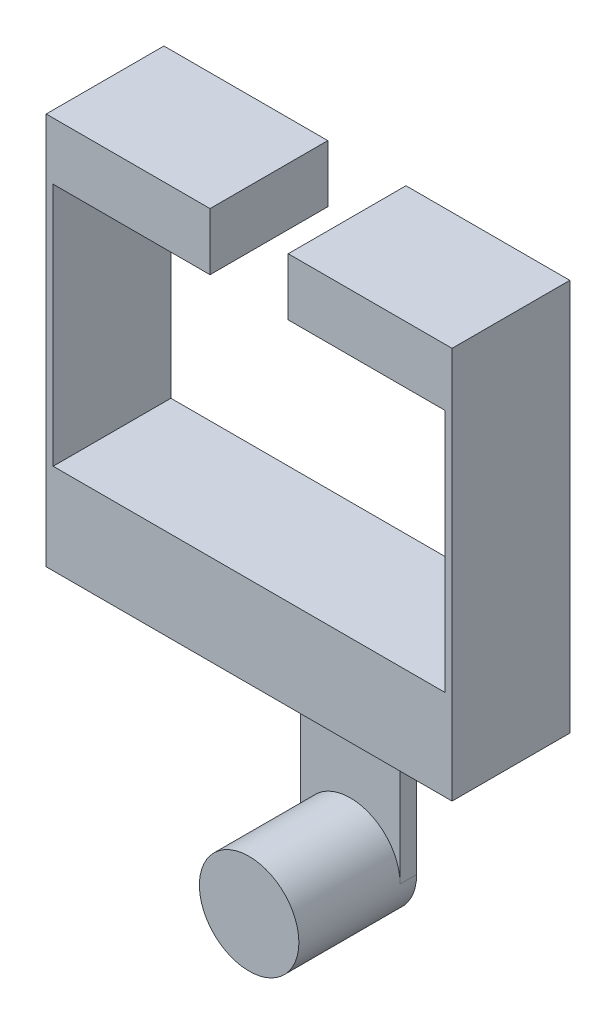
ISO-10303-21;
HEADER;
FILE_DESCRIPTION(('STEP AP214'),'2;1');
FILE_NAME('part.step','',(''),(''),'','','');
FILE_SCHEMA(('AUTOMOTIVE_DESIGN { 1 0 10303 214 1 1 1 1 }'));
ENDSEC;
DATA;
#1=APPLICATION_CONTEXT('core data for automotive mechanical design processes');
#2=APPLICATION_PROTOCOL_DEFINITION('international standard','automotive_design',2000,#1);
#3=PRODUCT_CONTEXT('',#1,'mechanical');
#4=PRODUCT('Part','Part','',(#3));
#5=PRODUCT_RELATED_PRODUCT_CATEGORY('part','',(#4));
#6=PRODUCT_DEFINITION_FORMATION('','',#4);
#7=PRODUCT_DEFINITION_CONTEXT('part definition',#1,'design');
#8=PRODUCT_DEFINITION('design','',#6,#7);
#9=PRODUCT_DEFINITION_SHAPE('','',#8);
#10=(LENGTH_UNIT() NAMED_UNIT(*) SI_UNIT(.MILLI.,.METRE.));
#11=(NAMED_UNIT(*) PLANE_ANGLE_UNIT() SI_UNIT($,.RADIAN.));
#12=(NAMED_UNIT(*) SI_UNIT($,.STERADIAN.) SOLID_ANGLE_UNIT());
#13=UNCERTAINTY_MEASURE_WITH_UNIT(LENGTH_MEASURE(1.E-05),#10,'distance_accuracy_value','');
#14=(GEOMETRIC_REPRESENTATION_CONTEXT(3) GLOBAL_UNCERTAINTY_ASSIGNED_CONTEXT((#13)) GLOBAL_UNIT_ASSIGNED_CONTEXT((#10,
#11,#12)) REPRESENTATION_CONTEXT('',''));
#15=CARTESIAN_POINT('',(0.,0.,0.));
#16=DIRECTION('',(0.,0.,1.));
#17=DIRECTION('',(1.,0.,0.));
#18=AXIS2_PLACEMENT_3D('',#15,#16,#17);
#19=CARTESIAN_POINT('',(0.,0.,19.05));
#20=DIRECTION('',(0.,0.,-1.));
#21=DIRECTION('',(-1.,0.,0.));
#22=AXIS2_PLACEMENT_3D('',#19,#20,#21);
#23=CYLINDRICAL_SURFACE('',#22,8.04977532478733);
#24=CARTESIAN_POINT('',(0.,0.,19.05));
#25=DIRECTION('',(0.,0.,1.));
#26=DIRECTION('',(1.,0.,0.));
#27=AXIS2_PLACEMENT_3D('',#24,#25,#26);
#28=CIRCLE('',#27,8.04977532478733);
#29=CARTESIAN_POINT('',(8.04977532478733,0.,19.05));
#30=VERTEX_POINT('',#29);
#31=EDGE_CURVE('E52',#30,#30,#28,.T.);
#32=ORIENTED_EDGE('',*,*,#31,.F.);
#33=EDGE_LOOP('',(#32));
#34=FACE_BOUND('',#33,.T.);
#35=DIRECTION('',(0.,0.,-1.));
#36=VECTOR('',#35,1.);
#37=CARTESIAN_POINT('',(8.04977532478733,0.,2.67154454200887));
#38=LINE('',#37,#36);
#39=CARTESIAN_POINT('',(8.04977532478733,0.,2.67154454200887));
#40=VERTEX_POINT('',#39);
#41=CARTESIAN_POINT('',(8.04977532478733,0.,0.));
#42=VERTEX_POINT('',#41);
#43=EDGE_CURVE('E274',#40,#42,#38,.T.);
#44=ORIENTED_EDGE('',*,*,#43,.F.);
#45=CARTESIAN_POINT('',(0.,0.,2.67154454200887));
#46=DIRECTION('',(0.,0.,-1.));
#47=DIRECTION('',(-1.,0.,0.));
#48=AXIS2_PLACEMENT_3D('',#45,#46,#47);
#49=CIRCLE('',#48,8.04977532478733);
#50=CARTESIAN_POINT('',(-8.04977532478733,0.,2.67154454200887));
#51=VERTEX_POINT('',#50);
#52=EDGE_CURVE('E11',#51,#40,#49,.T.);
#53=ORIENTED_EDGE('',*,*,#52,.F.);
#54=DIRECTION('',(0.,0.,-1.));
#55=VECTOR('',#54,1.);
#56=CARTESIAN_POINT('',(-8.04977532478733,0.,2.67154454200887));
#57=LINE('',#56,#55);
#58=CARTESIAN_POINT('',(-8.04977532478733,0.,0.));
#59=VERTEX_POINT('',#58);
#60=EDGE_CURVE('E65',#51,#59,#57,.T.);
#61=ORIENTED_EDGE('',*,*,#60,.T.);
#62=CARTESIAN_POINT('',(0.,0.,0.));
#63=DIRECTION('',(0.,0.,1.));
#64=DIRECTION('',(1.,0.,0.));
#65=AXIS2_PLACEMENT_3D('',#62,#63,#64);
#66=CIRCLE('',#65,8.04977532478733);
#67=EDGE_CURVE('E279',#59,#42,#66,.T.);
#68=ORIENTED_EDGE('',*,*,#67,.T.);
#69=EDGE_LOOP('',(#44,#53,#61,#68));
#70=FACE_BOUND('',#69,.T.);
#71=ADVANCED_FACE('F46',(#34,#70),#23,.T.);
#72=CARTESIAN_POINT('',(0.,0.,19.05));
#73=DIRECTION('',(0.,0.,1.));
#74=DIRECTION('',(1.,0.,0.));
#75=AXIS2_PLACEMENT_3D('',#72,#73,#74);
#76=PLANE('',#75);
#77=ORIENTED_EDGE('',*,*,#31,.T.);
#78=EDGE_LOOP('',(#77));
#79=FACE_BOUND('',#78,.T.);
#80=ADVANCED_FACE('F348',(#79),#76,.T.);
#81=CARTESIAN_POINT('',(0.,0.,0.));
#82=DIRECTION('',(0.,0.,1.));
#83=DIRECTION('',(1.,0.,0.));
#84=AXIS2_PLACEMENT_3D('',#81,#82,#83);
#85=PLANE('',#84);
#86=DIRECTION('',(-1.,0.,0.));
#87=VECTOR('',#86,1.);
#88=CARTESIAN_POINT('',(-31.70428,32.1991012991493,0.));
#89=LINE('',#88,#87);
#90=CARTESIAN_POINT('',(-8.04977532478733,32.1991012991493,0.));
#91=VERTEX_POINT('',#90);
#92=CARTESIAN_POINT('',(-32.8331688888889,32.1991012991493,0.));
#93=VERTEX_POINT('',#92);
#94=EDGE_CURVE('E261',#91,#93,#89,.T.);
#95=ORIENTED_EDGE('',*,*,#94,.T.);
#96=DIRECTION('',(0.,1.,0.));
#97=VECTOR('',#96,1.);
#98=CARTESIAN_POINT('',(-32.8331688888889,32.1991012991493,0.));
#99=LINE('',#98,#97);
#100=CARTESIAN_POINT('',(-32.8331688888889,95.6443099394102,0.));
#101=VERTEX_POINT('',#100);
#102=EDGE_CURVE('E164',#93,#101,#99,.T.);
#103=ORIENTED_EDGE('',*,*,#102,.T.);
#104=DIRECTION('',(1.,0.,0.));
#105=VECTOR('',#104,1.);
#106=CARTESIAN_POINT('',(-32.8331688888889,95.6443099394102,0.));
#107=LINE('',#106,#105);
#108=CARTESIAN_POINT('',(-6.32460000000001,95.6443099394102,0.));
#109=VERTEX_POINT('',#108);
#110=EDGE_CURVE('E172',#101,#109,#107,.T.);
#111=ORIENTED_EDGE('',*,*,#110,.T.);
#112=DIRECTION('',(0.,-1.,0.));
#113=VECTOR('',#112,1.);
#114=CARTESIAN_POINT('',(-6.32460000000001,95.6443099394102,0.));
#115=LINE('',#114,#113);
#116=CARTESIAN_POINT('',(-6.32460000000001,86.373251948724,0.));
#117=VERTEX_POINT('',#116);
#118=EDGE_CURVE('E190',#109,#117,#115,.T.);
#119=ORIENTED_EDGE('',*,*,#118,.T.);
#120=DIRECTION('',(1.,0.,0.));
#121=VECTOR('',#120,1.);
#122=CARTESIAN_POINT('',(-32.8331688888889,86.373251948724,0.));
#123=LINE('',#122,#121);
#124=CARTESIAN_POINT('',(-31.70428,86.373251948724,0.));
#125=VERTEX_POINT('',#124);
#126=EDGE_CURVE('E178',#125,#117,#123,.T.);
#127=ORIENTED_EDGE('',*,*,#126,.F.);
#128=DIRECTION('',(0.,1.,0.));
#129=VECTOR('',#128,1.);
#130=CARTESIAN_POINT('',(-31.70428,32.1991012991493,0.));
#131=LINE('',#130,#129);
#132=CARTESIAN_POINT('',(-31.70428,46.8532357510142,0.));
#133=VERTEX_POINT('',#132);
#134=EDGE_CURVE('E167',#133,#125,#131,.T.);
#135=ORIENTED_EDGE('',*,*,#134,.F.);
#136=DIRECTION('',(-1.,0.,0.));
#137=VECTOR('',#136,1.);
#138=CARTESIAN_POINT('',(-31.70428,46.8532357510142,0.));
#139=LINE('',#138,#137);
#140=CARTESIAN_POINT('',(31.70428,46.8532357510142,0.));
#141=VERTEX_POINT('',#140);
#142=EDGE_CURVE('E258',#141,#133,#139,.T.);
#143=ORIENTED_EDGE('',*,*,#142,.F.);
#144=DIRECTION('',(0.,1.,0.));
#145=VECTOR('',#144,1.);
#146=CARTESIAN_POINT('',(31.70428,32.1991012991493,0.));
#147=LINE('',#146,#145);
#148=CARTESIAN_POINT('',(31.70428,86.373251948724,0.));
#149=VERTEX_POINT('',#148);
#150=EDGE_CURVE('E245',#141,#149,#147,.T.);
#151=ORIENTED_EDGE('',*,*,#150,.T.);
#152=DIRECTION('',(-1.,0.,0.));
#153=VECTOR('',#152,1.);
#154=CARTESIAN_POINT('',(32.8331688888889,86.373251948724,0.));
#155=LINE('',#154,#153);
#156=CARTESIAN_POINT('',(6.32460000000001,86.373251948724,0.));
#157=VERTEX_POINT('',#156);
#158=EDGE_CURVE('E197',#149,#157,#155,.T.);
#159=ORIENTED_EDGE('',*,*,#158,.T.);
#160=DIRECTION('',(0.,-1.,0.));
#161=VECTOR('',#160,1.);
#162=CARTESIAN_POINT('',(6.32460000000001,95.6443099394102,0.));
#163=LINE('',#162,#161);
#164=CARTESIAN_POINT('',(6.32460000000001,95.6443099394102,0.));
#165=VERTEX_POINT('',#164);
#166=EDGE_CURVE('E220',#165,#157,#163,.T.);
#167=ORIENTED_EDGE('',*,*,#166,.F.);
#168=DIRECTION('',(-1.,0.,0.));
#169=VECTOR('',#168,1.);
#170=CARTESIAN_POINT('',(32.8331688888889,95.6443099394102,0.));
#171=LINE('',#170,#169);
#172=CARTESIAN_POINT('',(32.8331688888889,95.6443099394102,0.));
#173=VERTEX_POINT('',#172);
#174=EDGE_CURVE('E203',#173,#165,#171,.T.);
#175=ORIENTED_EDGE('',*,*,#174,.F.);
#176=DIRECTION('',(0.,1.,0.));
#177=VECTOR('',#176,1.);
#178=CARTESIAN_POINT('',(32.8331688888889,32.1991012991493,0.));
#179=LINE('',#178,#177);
#180=CARTESIAN_POINT('',(32.8331688888889,32.1991012991493,0.));
#181=VERTEX_POINT('',#180);
#182=EDGE_CURVE('E240',#181,#173,#179,.T.);
#183=ORIENTED_EDGE('',*,*,#182,.F.);
#184=CARTESIAN_POINT('',(8.04977532478733,32.1991012991493,0.));
#185=VERTEX_POINT('',#184);
#186=EDGE_CURVE('E246',#181,#185,#89,.T.);
#187=ORIENTED_EDGE('',*,*,#186,.T.);
#188=DIRECTION('',(0.,1.,0.));
#189=VECTOR('',#188,1.);
#190=CARTESIAN_POINT('',(8.04977532478733,0.,0.));
#191=LINE('',#190,#189);
#192=EDGE_CURVE('E268',#42,#185,#191,.T.);
#193=ORIENTED_EDGE('',*,*,#192,.F.);
#194=ORIENTED_EDGE('',*,*,#67,.F.);
#195=DIRECTION('',(0.,1.,0.));
#196=VECTOR('',#195,1.);
#197=CARTESIAN_POINT('',(-8.04977532478733,0.,0.));
#198=LINE('',#197,#196);
#199=EDGE_CURVE('E259',#59,#91,#198,.T.);
#200=ORIENTED_EDGE('',*,*,#199,.T.);
#201=EDGE_LOOP('',(#95,#103,#111,#119,#127,#135,#143,#151,#159,#167,#175,#183,#187,#193,#194,#200));
#202=FACE_BOUND('',#201,.T.);
#203=ADVANCED_FACE('F291',(#202),#85,.F.);
#204=CARTESIAN_POINT('',(8.04977532478733,0.,2.67154454200887));
#205=DIRECTION('',(-1.,0.,0.));
#206=DIRECTION('',(0.,0.,1.));
#207=AXIS2_PLACEMENT_3D('',#204,#205,#206);
#208=PLANE('',#207);
#209=ORIENTED_EDGE('',*,*,#192,.T.);
#210=DIRECTION('',(0.,0.,-1.));
#211=VECTOR('',#210,1.);
#212=CARTESIAN_POINT('',(8.04977532478733,32.1991012991493,2.67154454200887));
#213=LINE('',#212,#211);
#214=CARTESIAN_POINT('',(8.04977532478733,32.1991012991493,2.67154454200887));
#215=VERTEX_POINT('',#214);
#216=EDGE_CURVE('E276',#215,#185,#213,.T.);
#217=ORIENTED_EDGE('',*,*,#216,.F.);
#218=DIRECTION('',(0.,1.,0.));
#219=VECTOR('',#218,1.);
#220=CARTESIAN_POINT('',(8.04977532478733,0.,2.67154454200887));
#221=LINE('',#220,#219);
#222=EDGE_CURVE('E269',#40,#215,#221,.T.);
#223=ORIENTED_EDGE('',*,*,#222,.F.);
#224=ORIENTED_EDGE('',*,*,#43,.T.);
#225=EDGE_LOOP('',(#209,#217,#223,#224));
#226=FACE_BOUND('',#225,.T.);
#227=ADVANCED_FACE('F292',(#226),#208,.F.);
#228=CARTESIAN_POINT('',(-8.04977532478733,0.,2.67154454200887));
#229=DIRECTION('',(-1.,0.,0.));
#230=DIRECTION('',(0.,0.,1.));
#231=AXIS2_PLACEMENT_3D('',#228,#229,#230);
#232=PLANE('',#231);
#233=ORIENTED_EDGE('',*,*,#199,.F.);
#234=ORIENTED_EDGE('',*,*,#60,.F.);
#235=DIRECTION('',(0.,1.,0.));
#236=VECTOR('',#235,1.);
#237=CARTESIAN_POINT('',(-8.04977532478733,0.,2.67154454200887));
#238=LINE('',#237,#236);
#239=CARTESIAN_POINT('',(-8.04977532478733,32.1991012991493,2.67154454200887));
#240=VERTEX_POINT('',#239);
#241=EDGE_CURVE('E262',#51,#240,#238,.T.);
#242=ORIENTED_EDGE('',*,*,#241,.T.);
#243=DIRECTION('',(0.,0.,-1.));
#244=VECTOR('',#243,1.);
#245=CARTESIAN_POINT('',(-8.04977532478733,32.1991012991493,2.67154454200887));
#246=LINE('',#245,#244);
#247=EDGE_CURVE('E285',#240,#91,#246,.T.);
#248=ORIENTED_EDGE('',*,*,#247,.T.);
#249=EDGE_LOOP('',(#233,#234,#242,#248));
#250=FACE_BOUND('',#249,.T.);
#251=ADVANCED_FACE('F333',(#250),#232,.T.);
#252=CARTESIAN_POINT('',(0.,0.,2.67154454200887));
#253=DIRECTION('',(0.,0.,-1.));
#254=DIRECTION('',(-1.,0.,0.));
#255=AXIS2_PLACEMENT_3D('',#252,#253,#254);
#256=PLANE('',#255);
#257=ORIENTED_EDGE('',*,*,#241,.F.);
#258=ORIENTED_EDGE('',*,*,#52,.T.);
#259=ORIENTED_EDGE('',*,*,#222,.T.);
#260=DIRECTION('',(-1.,0.,0.));
#261=VECTOR('',#260,1.);
#262=CARTESIAN_POINT('',(8.04977532478733,32.1991012991493,2.67154454200887));
#263=LINE('',#262,#261);
#264=EDGE_CURVE('E270',#215,#240,#263,.T.);
#265=ORIENTED_EDGE('',*,*,#264,.T.);
#266=EDGE_LOOP('',(#257,#258,#259,#265));
#267=FACE_BOUND('',#266,.T.);
#268=ADVANCED_FACE('F336',(#267),#256,.F.);
#269=CARTESIAN_POINT('',(-31.70428,46.8532357510142,19.05));
#270=DIRECTION('',(0.,0.,-1.));
#271=DIRECTION('',(-1.,0.,0.));
#272=AXIS2_PLACEMENT_3D('',#269,#270,#271);
#273=PLANE('',#272);
#274=DIRECTION('',(1.,0.,0.));
#275=VECTOR('',#274,1.);
#276=CARTESIAN_POINT('',(-31.70428,46.8532357510142,19.05));
#277=LINE('',#276,#275);
#278=CARTESIAN_POINT('',(-31.70428,46.8532357510142,19.05));
#279=VERTEX_POINT('',#278);
#280=CARTESIAN_POINT('',(31.70428,46.8532357510142,19.05));
#281=VERTEX_POINT('',#280);
#282=EDGE_CURVE('E250',#279,#281,#277,.T.);
#283=ORIENTED_EDGE('',*,*,#282,.F.);
#284=DIRECTION('',(0.,-1.,0.));
#285=VECTOR('',#284,1.);
#286=CARTESIAN_POINT('',(-31.70428,32.1991012991493,19.05));
#287=LINE('',#286,#285);
#288=CARTESIAN_POINT('',(-31.70428,86.373251948724,19.05));
#289=VERTEX_POINT('',#288);
#290=EDGE_CURVE('E218',#289,#279,#287,.T.);
#291=ORIENTED_EDGE('',*,*,#290,.F.);
#292=DIRECTION('',(-1.,0.,0.));
#293=VECTOR('',#292,1.);
#294=CARTESIAN_POINT('',(-32.8331688888889,86.373251948724,19.05));
#295=LINE('',#294,#293);
#296=CARTESIAN_POINT('',(-6.32460000000001,86.373251948724,19.05));
#297=VERTEX_POINT('',#296);
#298=EDGE_CURVE('E186',#297,#289,#295,.T.);
#299=ORIENTED_EDGE('',*,*,#298,.F.);
#300=DIRECTION('',(0.,-1.,0.));
#301=VECTOR('',#300,1.);
#302=CARTESIAN_POINT('',(-6.32460000000001,95.6443099394102,19.05));
#303=LINE('',#302,#301);
#304=CARTESIAN_POINT('',(-6.32460000000001,95.6443099394102,19.05));
#305=VERTEX_POINT('',#304);
#306=EDGE_CURVE('E182',#305,#297,#303,.T.);
#307=ORIENTED_EDGE('',*,*,#306,.F.);
#308=DIRECTION('',(-1.,0.,0.));
#309=VECTOR('',#308,1.);
#310=CARTESIAN_POINT('',(-32.8331688888889,95.6443099394102,19.05));
#311=LINE('',#310,#309);
#312=CARTESIAN_POINT('',(-32.8331688888889,95.6443099394102,19.05));
#313=VERTEX_POINT('',#312);
#314=EDGE_CURVE('E175',#305,#313,#311,.T.);
#315=ORIENTED_EDGE('',*,*,#314,.T.);
#316=DIRECTION('',(0.,-1.,0.));
#317=VECTOR('',#316,1.);
#318=CARTESIAN_POINT('',(-32.8331688888889,32.1991012991493,19.05));
#319=LINE('',#318,#317);
#320=CARTESIAN_POINT('',(-32.8331688888889,32.1991012991493,19.05));
#321=VERTEX_POINT('',#320);
#322=EDGE_CURVE('E154',#313,#321,#319,.T.);
#323=ORIENTED_EDGE('',*,*,#322,.T.);
#324=DIRECTION('',(1.,0.,0.));
#325=VECTOR('',#324,1.);
#326=CARTESIAN_POINT('',(-31.70428,32.1991012991493,19.05));
#327=LINE('',#326,#325);
#328=CARTESIAN_POINT('',(32.8331688888889,32.1991012991493,19.05));
#329=VERTEX_POINT('',#328);
#330=EDGE_CURVE('E239',#321,#329,#327,.T.);
#331=ORIENTED_EDGE('',*,*,#330,.T.);
#332=DIRECTION('',(0.,-1.,0.));
#333=VECTOR('',#332,1.);
#334=CARTESIAN_POINT('',(32.8331688888889,32.1991012991493,19.05));
#335=LINE('',#334,#333);
#336=CARTESIAN_POINT('',(32.8331688888889,95.6443099394102,19.05));
#337=VERTEX_POINT('',#336);
#338=EDGE_CURVE('E227',#337,#329,#335,.T.);
#339=ORIENTED_EDGE('',*,*,#338,.F.);
#340=DIRECTION('',(1.,0.,0.));
#341=VECTOR('',#340,1.);
#342=CARTESIAN_POINT('',(32.8331688888889,95.6443099394102,19.05));
#343=LINE('',#342,#341);
#344=CARTESIAN_POINT('',(6.32460000000001,95.6443099394102,19.05));
#345=VERTEX_POINT('',#344);
#346=EDGE_CURVE('E206',#345,#337,#343,.T.);
#347=ORIENTED_EDGE('',*,*,#346,.F.);
#348=DIRECTION('',(0.,-1.,0.));
#349=VECTOR('',#348,1.);
#350=CARTESIAN_POINT('',(6.32460000000001,95.6443099394102,19.05));
#351=LINE('',#350,#349);
#352=CARTESIAN_POINT('',(6.32460000000001,86.373251948724,19.05));
#353=VERTEX_POINT('',#352);
#354=EDGE_CURVE('E207',#345,#353,#351,.T.);
#355=ORIENTED_EDGE('',*,*,#354,.T.);
#356=DIRECTION('',(1.,0.,0.));
#357=VECTOR('',#356,1.);
#358=CARTESIAN_POINT('',(32.8331688888889,86.373251948724,19.05));
#359=LINE('',#358,#357);
#360=CARTESIAN_POINT('',(31.70428,86.373251948724,19.05));
#361=VERTEX_POINT('',#360);
#362=EDGE_CURVE('E205',#353,#361,#359,.T.);
#363=ORIENTED_EDGE('',*,*,#362,.T.);
#364=DIRECTION('',(0.,-1.,0.));
#365=VECTOR('',#364,1.);
#366=CARTESIAN_POINT('',(31.70428,32.1991012991493,19.05));
#367=LINE('',#366,#365);
#368=EDGE_CURVE('E224',#361,#281,#367,.T.);
#369=ORIENTED_EDGE('',*,*,#368,.T.);
#370=EDGE_LOOP('',(#283,#291,#299,#307,#315,#323,#331,#339,#347,#355,#363,#369));
#371=FACE_BOUND('',#370,.T.);
#372=ADVANCED_FACE('F180',(#371),#273,.F.);
#373=CARTESIAN_POINT('',(0.,46.8532357510142,0.));
#374=DIRECTION('',(0.,1.,0.));
#375=DIRECTION('',(0.,0.,1.));
#376=AXIS2_PLACEMENT_3D('',#373,#374,#375);
#377=PLANE('',#376);
#378=DIRECTION('',(0.,0.,1.));
#379=VECTOR('',#378,1.);
#380=CARTESIAN_POINT('',(-31.70428,46.8532357510142,0.));
#381=LINE('',#380,#379);
#382=EDGE_CURVE('E248',#133,#279,#381,.T.);
#383=ORIENTED_EDGE('',*,*,#382,.T.);
#384=ORIENTED_EDGE('',*,*,#282,.T.);
#385=DIRECTION('',(0.,0.,-1.));
#386=VECTOR('',#385,1.);
#387=CARTESIAN_POINT('',(31.70428,46.8532357510142,0.));
#388=LINE('',#387,#386);
#389=EDGE_CURVE('E251',#281,#141,#388,.T.);
#390=ORIENTED_EDGE('',*,*,#389,.T.);
#391=ORIENTED_EDGE('',*,*,#142,.T.);
#392=EDGE_LOOP('',(#383,#384,#390,#391));
#393=FACE_BOUND('',#392,.T.);
#394=ADVANCED_FACE('F321',(#393),#377,.T.);
#395=CARTESIAN_POINT('',(0.,32.1991012991493,0.));
#396=DIRECTION('',(0.,1.,0.));
#397=DIRECTION('',(0.,0.,1.));
#398=AXIS2_PLACEMENT_3D('',#395,#396,#397);
#399=PLANE('',#398);
#400=DIRECTION('',(0.,0.,-1.));
#401=VECTOR('',#400,1.);
#402=CARTESIAN_POINT('',(32.8331688888889,32.1991012991493,19.05));
#403=LINE('',#402,#401);
#404=EDGE_CURVE('E232',#329,#181,#403,.T.);
#405=ORIENTED_EDGE('',*,*,#404,.F.);
#406=ORIENTED_EDGE('',*,*,#330,.F.);
#407=DIRECTION('',(0.,0.,-1.));
#408=VECTOR('',#407,1.);
#409=CARTESIAN_POINT('',(-32.8331688888889,32.1991012991493,19.05));
#410=LINE('',#409,#408);
#411=EDGE_CURVE('E165',#321,#93,#410,.T.);
#412=ORIENTED_EDGE('',*,*,#411,.T.);
#413=ORIENTED_EDGE('',*,*,#94,.F.);
#414=ORIENTED_EDGE('',*,*,#247,.F.);
#415=ORIENTED_EDGE('',*,*,#264,.F.);
#416=ORIENTED_EDGE('',*,*,#216,.T.);
#417=ORIENTED_EDGE('',*,*,#186,.F.);
#418=EDGE_LOOP('',(#405,#406,#412,#413,#414,#415,#416,#417));
#419=FACE_BOUND('',#418,.T.);
#420=ADVANCED_FACE('F296',(#419),#399,.F.);
#421=CARTESIAN_POINT('',(31.70428,0.,0.));
#422=DIRECTION('',(-1.,0.,0.));
#423=DIRECTION('',(0.,0.,1.));
#424=AXIS2_PLACEMENT_3D('',#421,#422,#423);
#425=PLANE('',#424);
#426=ORIENTED_EDGE('',*,*,#389,.F.);
#427=ORIENTED_EDGE('',*,*,#368,.F.);
#428=DIRECTION('',(0.,0.,1.));
#429=VECTOR('',#428,1.);
#430=CARTESIAN_POINT('',(31.70428,86.373251948724,19.05));
#431=LINE('',#430,#429);
#432=EDGE_CURVE('E235',#149,#361,#431,.T.);
#433=ORIENTED_EDGE('',*,*,#432,.F.);
#434=ORIENTED_EDGE('',*,*,#150,.F.);
#435=EDGE_LOOP('',(#426,#427,#433,#434));
#436=FACE_BOUND('',#435,.T.);
#437=ADVANCED_FACE('F318',(#436),#425,.T.);
#438=CARTESIAN_POINT('',(32.8331688888889,0.,0.));
#439=DIRECTION('',(-1.,0.,0.));
#440=DIRECTION('',(0.,0.,1.));
#441=AXIS2_PLACEMENT_3D('',#438,#439,#440);
#442=PLANE('',#441);
#443=ORIENTED_EDGE('',*,*,#338,.T.);
#444=ORIENTED_EDGE('',*,*,#404,.T.);
#445=ORIENTED_EDGE('',*,*,#182,.T.);
#446=DIRECTION('',(0.,0.,-1.));
#447=VECTOR('',#446,1.);
#448=CARTESIAN_POINT('',(32.8331688888889,95.6443099394102,19.05));
#449=LINE('',#448,#447);
#450=EDGE_CURVE('E196',#337,#173,#449,.T.);
#451=ORIENTED_EDGE('',*,*,#450,.F.);
#452=EDGE_LOOP('',(#443,#444,#445,#451));
#453=FACE_BOUND('',#452,.T.);
#454=ADVANCED_FACE('F303',(#453),#442,.F.);
#455=CARTESIAN_POINT('',(-31.70428,0.,0.));
#456=DIRECTION('',(1.,0.,0.));
#457=DIRECTION('',(0.,0.,1.));
#458=AXIS2_PLACEMENT_3D('',#455,#456,#457);
#459=PLANE('',#458);
#460=ORIENTED_EDGE('',*,*,#382,.F.);
#461=ORIENTED_EDGE('',*,*,#134,.T.);
#462=DIRECTION('',(0.,0.,1.));
#463=VECTOR('',#462,1.);
#464=CARTESIAN_POINT('',(-31.70428,86.373251948724,19.05));
#465=LINE('',#464,#463);
#466=EDGE_CURVE('E223',#125,#289,#465,.T.);
#467=ORIENTED_EDGE('',*,*,#466,.T.);
#468=ORIENTED_EDGE('',*,*,#290,.T.);
#469=EDGE_LOOP('',(#460,#461,#467,#468));
#470=FACE_BOUND('',#469,.T.);
#471=ADVANCED_FACE('F324',(#470),#459,.T.);
#472=CARTESIAN_POINT('',(-32.8331688888889,0.,0.));
#473=DIRECTION('',(1.,0.,0.));
#474=DIRECTION('',(0.,0.,1.));
#475=AXIS2_PLACEMENT_3D('',#472,#473,#474);
#476=PLANE('',#475);
#477=ORIENTED_EDGE('',*,*,#322,.F.);
#478=DIRECTION('',(0.,0.,-1.));
#479=VECTOR('',#478,1.);
#480=CARTESIAN_POINT('',(-32.8331688888889,95.6443099394102,19.05));
#481=LINE('',#480,#479);
#482=EDGE_CURVE('E157',#313,#101,#481,.T.);
#483=ORIENTED_EDGE('',*,*,#482,.T.);
#484=ORIENTED_EDGE('',*,*,#102,.F.);
#485=ORIENTED_EDGE('',*,*,#411,.F.);
#486=EDGE_LOOP('',(#477,#483,#484,#485));
#487=FACE_BOUND('',#486,.T.);
#488=ADVANCED_FACE('F160',(#487),#476,.F.);
#489=CARTESIAN_POINT('',(0.,86.373251948724,0.));
#490=DIRECTION('',(0.,1.,0.));
#491=DIRECTION('',(0.,0.,1.));
#492=AXIS2_PLACEMENT_3D('',#489,#490,#491);
#493=PLANE('',#492);
#494=ORIENTED_EDGE('',*,*,#158,.F.);
#495=ORIENTED_EDGE('',*,*,#432,.T.);
#496=ORIENTED_EDGE('',*,*,#362,.F.);
#497=DIRECTION('',(0.,0.,1.));
#498=VECTOR('',#497,1.);
#499=CARTESIAN_POINT('',(6.32460000000001,86.373251948724,19.05));
#500=LINE('',#499,#498);
#501=EDGE_CURVE('E211',#157,#353,#500,.T.);
#502=ORIENTED_EDGE('',*,*,#501,.F.);
#503=EDGE_LOOP('',(#494,#495,#496,#502));
#504=FACE_BOUND('',#503,.T.);
#505=ADVANCED_FACE('F312',(#504),#493,.F.);
#506=CARTESIAN_POINT('',(6.32460000000001,95.6443099394102,19.05));
#507=DIRECTION('',(1.,0.,0.));
#508=DIRECTION('',(0.,0.,-1.));
#509=AXIS2_PLACEMENT_3D('',#506,#507,#508);
#510=PLANE('',#509);
#511=ORIENTED_EDGE('',*,*,#501,.T.);
#512=ORIENTED_EDGE('',*,*,#354,.F.);
#513=DIRECTION('',(0.,0.,1.));
#514=VECTOR('',#513,1.);
#515=CARTESIAN_POINT('',(6.32460000000001,95.6443099394102,19.05));
#516=LINE('',#515,#514);
#517=EDGE_CURVE('E204',#165,#345,#516,.T.);
#518=ORIENTED_EDGE('',*,*,#517,.F.);
#519=ORIENTED_EDGE('',*,*,#166,.T.);
#520=EDGE_LOOP('',(#511,#512,#518,#519));
#521=FACE_BOUND('',#520,.T.);
#522=ADVANCED_FACE('F309',(#521),#510,.F.);
#523=CARTESIAN_POINT('',(0.,95.6443099394102,0.));
#524=DIRECTION('',(0.,1.,0.));
#525=DIRECTION('',(0.,0.,1.));
#526=AXIS2_PLACEMENT_3D('',#523,#524,#525);
#527=PLANE('',#526);
#528=ORIENTED_EDGE('',*,*,#450,.T.);
#529=ORIENTED_EDGE('',*,*,#174,.T.);
#530=ORIENTED_EDGE('',*,*,#517,.T.);
#531=ORIENTED_EDGE('',*,*,#346,.T.);
#532=EDGE_LOOP('',(#528,#529,#530,#531));
#533=FACE_BOUND('',#532,.T.);
#534=ADVANCED_FACE('F301',(#533),#527,.T.);
#535=CARTESIAN_POINT('',(-6.32460000000001,95.6443099394102,19.05));
#536=DIRECTION('',(1.,0.,0.));
#537=DIRECTION('',(0.,0.,-1.));
#538=AXIS2_PLACEMENT_3D('',#535,#536,#537);
#539=PLANE('',#538);
#540=DIRECTION('',(0.,0.,1.));
#541=VECTOR('',#540,1.);
#542=CARTESIAN_POINT('',(-6.32460000000001,86.373251948724,19.05));
#543=LINE('',#542,#541);
#544=EDGE_CURVE('E187',#117,#297,#543,.T.);
#545=ORIENTED_EDGE('',*,*,#544,.F.);
#546=ORIENTED_EDGE('',*,*,#118,.F.);
#547=DIRECTION('',(0.,0.,1.));
#548=VECTOR('',#547,1.);
#549=CARTESIAN_POINT('',(-6.32460000000001,95.6443099394102,19.05));
#550=LINE('',#549,#548);
#551=EDGE_CURVE('E185',#109,#305,#550,.T.);
#552=ORIENTED_EDGE('',*,*,#551,.T.);
#553=ORIENTED_EDGE('',*,*,#306,.T.);
#554=EDGE_LOOP('',(#545,#546,#552,#553));
#555=FACE_BOUND('',#554,.T.);
#556=ADVANCED_FACE('F332',(#555),#539,.T.);
#557=CARTESIAN_POINT('',(0.,95.6443099394102,0.));
#558=DIRECTION('',(0.,1.,0.));
#559=DIRECTION('',(0.,0.,1.));
#560=AXIS2_PLACEMENT_3D('',#557,#558,#559);
#561=PLANE('',#560);
#562=ORIENTED_EDGE('',*,*,#482,.F.);
#563=ORIENTED_EDGE('',*,*,#314,.F.);
#564=ORIENTED_EDGE('',*,*,#551,.F.);
#565=ORIENTED_EDGE('',*,*,#110,.F.);
#566=EDGE_LOOP('',(#562,#563,#564,#565));
#567=FACE_BOUND('',#566,.T.);
#568=ADVANCED_FACE('F168',(#567),#561,.T.);
#569=CARTESIAN_POINT('',(0.,86.373251948724,0.));
#570=DIRECTION('',(0.,1.,0.));
#571=DIRECTION('',(0.,0.,1.));
#572=AXIS2_PLACEMENT_3D('',#569,#570,#571);
#573=PLANE('',#572);
#574=ORIENTED_EDGE('',*,*,#466,.F.);
#575=ORIENTED_EDGE('',*,*,#126,.T.);
#576=ORIENTED_EDGE('',*,*,#544,.T.);
#577=ORIENTED_EDGE('',*,*,#298,.T.);
#578=EDGE_LOOP('',(#574,#575,#576,#577));
#579=FACE_BOUND('',#578,.T.);
#580=ADVANCED_FACE('F328',(#579),#573,.F.);
#581=CLOSED_SHELL('',(#71,#80,#203,#227,#251,#268,#372,#394,#420,#437,#454,#471,#488,#505,#522,
#534,#556,#568,#580));
#582=MANIFOLD_SOLID_BREP('B2',#581);
#583=ADVANCED_BREP_SHAPE_REPRESENTATION('',(#18,#582),#14);
#584=SHAPE_DEFINITION_REPRESENTATION(#9,#583);
ENDSEC;
END-ISO-10303-21;
